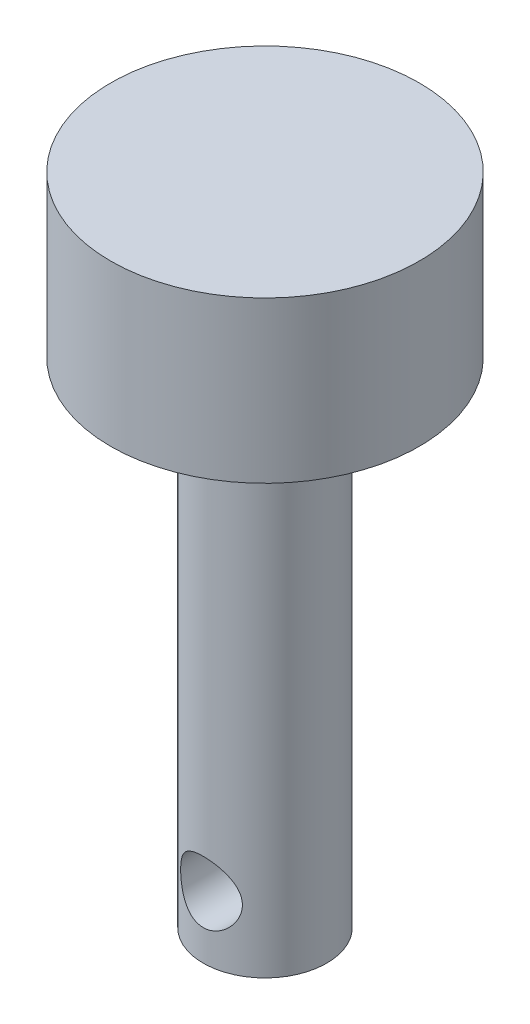
ISO-10303-21;
HEADER;
FILE_DESCRIPTION(('STEP AP214'),'2;1');
FILE_NAME('part.step','',(''),(''),'','','');
FILE_SCHEMA(('AUTOMOTIVE_DESIGN { 1 0 10303 214 1 1 1 1 }'));
ENDSEC;
DATA;
#1=APPLICATION_CONTEXT('core data for automotive mechanical design processes');
#2=APPLICATION_PROTOCOL_DEFINITION('international standard','automotive_design',2000,#1);
#3=PRODUCT_CONTEXT('',#1,'mechanical');
#4=PRODUCT('Part','Part','',(#3));
#5=PRODUCT_RELATED_PRODUCT_CATEGORY('part','',(#4));
#6=PRODUCT_DEFINITION_FORMATION('','',#4);
#7=PRODUCT_DEFINITION_CONTEXT('part definition',#1,'design');
#8=PRODUCT_DEFINITION('design','',#6,#7);
#9=PRODUCT_DEFINITION_SHAPE('','',#8);
#10=(LENGTH_UNIT() NAMED_UNIT(*) SI_UNIT(.MILLI.,.METRE.));
#11=(NAMED_UNIT(*) PLANE_ANGLE_UNIT() SI_UNIT($,.RADIAN.));
#12=(NAMED_UNIT(*) SI_UNIT($,.STERADIAN.) SOLID_ANGLE_UNIT());
#13=UNCERTAINTY_MEASURE_WITH_UNIT(LENGTH_MEASURE(1.E-05),#10,'distance_accuracy_value','');
#14=(GEOMETRIC_REPRESENTATION_CONTEXT(3) GLOBAL_UNCERTAINTY_ASSIGNED_CONTEXT((#13)) GLOBAL_UNIT_ASSIGNED_CONTEXT((#10,
#11,#12)) REPRESENTATION_CONTEXT('',''));
#15=CARTESIAN_POINT('',(0.,0.,0.));
#16=DIRECTION('',(0.,0.,1.));
#17=DIRECTION('',(1.,0.,0.));
#18=AXIS2_PLACEMENT_3D('',#15,#16,#17);
#19=CARTESIAN_POINT('',(0.,0.,0.));
#20=DIRECTION('',(0.,-1.,0.));
#21=DIRECTION('',(0.,0.,-1.));
#22=AXIS2_PLACEMENT_3D('',#19,#20,#21);
#23=CYLINDRICAL_SURFACE('',#22,5.);
#24=CARTESIAN_POINT('',(-2.5,5.,4.33012701892219));
#25=CARTESIAN_POINT('',(-2.49998948436432,5.13026650687649,4.33013982272991));
#26=CARTESIAN_POINT('',(-2.48974954513168,5.26070272067625,4.33609541965583));
#27=CARTESIAN_POINT('',(-2.44930840724944,5.51756897152923,4.35905877051907));
#28=CARTESIAN_POINT('',(-2.41906526369545,5.64399000405729,4.37608974726023));
#29=CARTESIAN_POINT('',(-2.3402497699757,5.88862894556107,4.41873376871659));
#30=CARTESIAN_POINT('',(-2.29177485369963,6.00688657356221,4.44430111338921));
#31=CARTESIAN_POINT('',(-2.17816884056414,6.23356056309455,4.50106659111455));
#32=CARTESIAN_POINT('',(-2.11303684262671,6.34197639179579,4.53226502875883));
#33=CARTESIAN_POINT('',(-1.96166634317253,6.55576430391693,4.59992173524851));
#34=CARTESIAN_POINT('',(-1.87413008816917,6.66014783448977,4.63660159331577));
#35=CARTESIAN_POINT('',(-1.68313452122752,6.8535209757132,4.70929956727453));
#36=CARTESIAN_POINT('',(-1.57966731506051,6.94250290775495,4.74531734512768));
#37=CARTESIAN_POINT('',(-1.35122390789082,7.10841787648564,4.81553692452135));
#38=CARTESIAN_POINT('',(-1.22526797235894,7.18413441927914,4.84945266064072));
#39=CARTESIAN_POINT('',(-0.960392566671147,7.31285213348386,4.90876890230193));
#40=CARTESIAN_POINT('',(-0.821481345389982,7.3658676404385,4.93417477954535));
#41=CARTESIAN_POINT('',(-0.545112359773523,7.44376165316397,4.9720115311507));
#42=CARTESIAN_POINT('',(-0.408254476210982,7.47037381586513,4.98523700553425));
#43=CARTESIAN_POINT('',(-0.131426571755676,7.50041529671129,5.00018959613973));
#44=CARTESIAN_POINT('',(0.00854151460650906,7.50385864199536,5.00192366961168));
#45=CARTESIAN_POINT('',(0.274581311061965,7.48813331506858,4.99407454791405));
#46=CARTESIAN_POINT('',(0.400802997942674,7.47090496119546,4.98546239730476));
#47=CARTESIAN_POINT('',(0.648284429795111,7.41779789023985,4.95935613149294));
#48=CARTESIAN_POINT('',(0.769543802734627,7.38191777755985,4.94186135165964));
#49=CARTESIAN_POINT('',(1.00577347892407,7.29229358477506,4.89928958219156));
#50=CARTESIAN_POINT('',(1.120633558788,7.23830921706972,4.87411103823003));
#51=CARTESIAN_POINT('',(1.33994200378327,7.11434145949638,4.81844114966712));
#52=CARTESIAN_POINT('',(1.4443866220966,7.04435234174416,4.78794790393709));
#53=CARTESIAN_POINT('',(1.6504341522455,6.88276162116743,4.72110985998074));
#54=CARTESIAN_POINT('',(1.75083518757341,6.78974242918497,4.68448439995438));
#55=CARTESIAN_POINT('',(1.93526092574445,6.58852568767457,4.61135851467029));
#56=CARTESIAN_POINT('',(2.01927302893558,6.48031656931485,4.57485820664072));
#57=CARTESIAN_POINT('',(2.17376333660553,6.24337951893978,4.50360390231212));
#58=CARTESIAN_POINT('',(2.24304328744513,6.11378494236447,4.46910799976769));
#59=CARTESIAN_POINT('',(2.35829778250308,5.8426558216025,4.4093862569644));
#60=CARTESIAN_POINT('',(2.40429664552723,5.70113391745609,4.38415075115168));
#61=CARTESIAN_POINT('',(2.4679505275626,5.42196372179303,4.34861589542586));
#62=CARTESIAN_POINT('',(2.48756280529994,5.28489720239113,4.33729139621241));
#63=CARTESIAN_POINT('',(2.50379236652857,5.00899664620864,4.32794798404024));
#64=CARTESIAN_POINT('',(2.50042589328757,4.8701639272005,4.32991967223279));
#65=CARTESIAN_POINT('',(2.47259010835991,4.6108652035532,4.34585841351462));
#66=CARTESIAN_POINT('',(2.45046954178116,4.49005137223027,4.35848968766635));
#67=CARTESIAN_POINT('',(2.38924071158112,4.25408053432252,4.39235053878353));
#68=CARTESIAN_POINT('',(2.35012694655908,4.13892537313315,4.41358290012585));
#69=CARTESIAN_POINT('',(2.25411897151217,3.91147167274361,4.46340555199141));
#70=CARTESIAN_POINT('',(2.19648515923163,3.79955245786744,4.49229108107657));
#71=CARTESIAN_POINT('',(2.0657176600397,3.5863268211512,4.55390298743125));
#72=CARTESIAN_POINT('',(1.99257601083123,3.48502589121186,4.58663133387872));
#73=CARTESIAN_POINT('',(1.82209291799636,3.28255308119668,4.65719996140836));
#74=CARTESIAN_POINT('',(1.72286318078435,3.18300712322778,4.69516457885708));
#75=CARTESIAN_POINT('',(1.5085112384988,3.00146940499409,4.76835587444746));
#76=CARTESIAN_POINT('',(1.39338368664988,2.91948357434145,4.80358162519329));
#77=CARTESIAN_POINT('',(1.14633840638507,2.77356568520911,4.86853404227334));
#78=CARTESIAN_POINT('',(1.01405774389062,2.71016720479154,4.89809104179855));
#79=CARTESIAN_POINT('',(0.738805911647332,2.60715524003798,4.9470838739847));
#80=CARTESIAN_POINT('',(0.595844253647067,2.56752087039488,4.96652859191746));
#81=CARTESIAN_POINT('',(0.317449205674706,2.51657859064358,4.99168770453968));
#82=CARTESIAN_POINT('',(0.182528609085376,2.50300531416965,4.99849819767838));
#83=CARTESIAN_POINT('',(-0.0878149643374311,2.49789183250541,5.00105325940467));
#84=CARTESIAN_POINT('',(-0.223237748727017,2.50634391433891,4.99680170177042));
#85=CARTESIAN_POINT('',(-0.481344982671073,2.54354103039551,4.97834922085637));
#86=CARTESIAN_POINT('',(-0.604280801321772,2.57091217163631,4.96482236636807));
#87=CARTESIAN_POINT('',(-0.843614873664455,2.64331744975833,4.92980234191731));
#88=CARTESIAN_POINT('',(-0.960012187087214,2.68835411963363,4.90830802955518));
#89=CARTESIAN_POINT('',(-1.18855854199593,2.79681781873926,4.85814826741488));
#90=CARTESIAN_POINT('',(-1.30031295715363,2.86094902468984,4.82921542506803));
#91=CARTESIAN_POINT('',(-1.51193650408535,3.00489411014759,4.76720333344986));
#92=CARTESIAN_POINT('',(-1.61180014305397,3.08471519262687,4.73412218229104));
#93=CARTESIAN_POINT('',(-1.8072854232437,3.26699579444936,4.66321523550925));
#94=CARTESIAN_POINT('',(-1.90149582349003,3.37091772600073,4.62524489658366));
#95=CARTESIAN_POINT('',(-2.07165660492504,3.59361528538223,4.55157698284941));
#96=CARTESIAN_POINT('',(-2.1475908315154,3.71240391419923,4.51588143910584));
#97=CARTESIAN_POINT('',(-2.28108393396029,3.96663611766426,4.44998982823926));
#98=CARTESIAN_POINT('',(-2.3379862797745,4.1024873884246,4.42000320346984));
#99=CARTESIAN_POINT('',(-2.40494911880459,4.31322264951977,4.38370272660093));
#100=CARTESIAN_POINT('',(-2.42419582683991,4.38455977569761,4.37305486646054));
#101=CARTESIAN_POINT('',(-2.45635087255789,4.52904069684933,4.35507574170935));
#102=CARTESIAN_POINT('',(-2.46926364179177,4.60218319095442,4.34774215854234));
#103=CARTESIAN_POINT('',(-2.48591166201423,4.72950098654694,4.3382377954292));
#104=CARTESIAN_POINT('',(-2.49118864979203,4.78341632151221,4.33520487024791));
#105=CARTESIAN_POINT('',(-2.49823512543934,4.89154461631041,4.33114674911323));
#106=CARTESIAN_POINT('',(-2.50000437866475,4.94575759581055,4.33012168747261));
#107=CARTESIAN_POINT('',(-2.5,5.,4.33012701892219));
#108=B_SPLINE_CURVE_WITH_KNOTS('',3,(#24,#25,#26,#27,#28,#29,#30,#31,#32,#33,#34,#35,#36,#37,
#38,#39,#40,#41,#42,#43,#44,#45,#46,#47,#48,#49,#50,#51,#52,#53,#54,#55,#56,#57,#58,#59,#60,#61,
#62,#63,#64,#65,#66,#67,#68,#69,#70,#71,#72,#73,#74,#75,#76,#77,#78,#79,#80,#81,#82,#83,#84,#85,
#86,#87,#88,#89,#90,#91,#92,#93,#94,#95,#96,#97,#98,#99,#100,#101,#102,#103,#104,#105,#106,
#107),.UNSPECIFIED.,.T.,.F.,(4,2,2,2,2,2,2,2,2,2,2,2,2,2,2,2,2,2,2,2,2,2,2,2,2,2,2,2,2,2,2,2,2,
2,2,2,2,2,2,2,2,4),(0.,0.390580306486789,0.781982232062013,1.17132148982692,1.56068181366371,
1.98215578129642,2.40383927716011,2.85394730601992,3.30377067414811,3.72158712424921,
4.13915059220183,4.52040243716429,4.90168281298721,5.2882383683295,5.67493248380763,
6.0981797864731,6.5217512061988,6.97222104328704,7.42221935534346,7.83655727140613,
8.25060232976016,8.61935458565148,8.98822631095241,9.37418241020303,9.76033715555202,
10.1951685895662,10.6301466245059,11.076604535375,11.5226694952701,11.927806759788,
12.3328021699001,12.7111106218382,13.0894733378512,13.4840187680376,13.8787457525688,
14.3127560463025,14.7471485711797,15.195268726016,15.4189244153949,15.6424233996907,
15.8050484542806,15.9676843870379),.UNSPECIFIED.);
#109=CARTESIAN_POINT('',(-2.5,5.,4.33012701892219));
#110=VERTEX_POINT('',#109);
#111=EDGE_CURVE('E51',#110,#110,#108,.T.);
#112=ORIENTED_EDGE('',*,*,#111,.T.);
#113=EDGE_LOOP('',(#112));
#114=FACE_BOUND('',#113,.T.);
#115=CARTESIAN_POINT('',(0.,40.,0.));
#116=DIRECTION('',(0.,-1.,0.));
#117=DIRECTION('',(0.,0.,-1.));
#118=AXIS2_PLACEMENT_3D('',#115,#116,#117);
#119=CIRCLE('',#118,5.);
#120=CARTESIAN_POINT('',(0.,40.,-5.));
#121=VERTEX_POINT('',#120);
#122=EDGE_CURVE('E48',#121,#121,#119,.T.);
#123=ORIENTED_EDGE('',*,*,#122,.T.);
#124=EDGE_LOOP('',(#123));
#125=FACE_BOUND('',#124,.T.);
#126=CARTESIAN_POINT('',(0.,0.,0.));
#127=DIRECTION('',(0.,-1.,0.));
#128=DIRECTION('',(0.,0.,-1.));
#129=AXIS2_PLACEMENT_3D('',#126,#127,#128);
#130=CIRCLE('',#129,5.);
#131=CARTESIAN_POINT('',(0.,0.,-5.));
#132=VERTEX_POINT('',#131);
#133=EDGE_CURVE('E85',#132,#132,#130,.T.);
#134=ORIENTED_EDGE('',*,*,#133,.F.);
#135=EDGE_LOOP('',(#134));
#136=FACE_BOUND('',#135,.T.);
#137=CARTESIAN_POINT('',(0.,7.5,-5.));
#138=CARTESIAN_POINT('',(-0.131426682334305,7.49999033094399,-4.99999177550472));
#139=CARTESIAN_POINT('',(-0.263015634437213,7.48957443822597,-4.99476199135277));
#140=CARTESIAN_POINT('',(-0.522301454622883,7.44836817883795,-4.9743541856102));
#141=CARTESIAN_POINT('',(-0.649990448564105,7.41753911907498,-4.9591572718767));
#142=CARTESIAN_POINT('',(-0.897333631316203,7.33701537728116,-4.92040690922477));
#143=CARTESIAN_POINT('',(-1.01701694536277,7.28739401221727,-4.89688595907259));
#144=CARTESIAN_POINT('',(-1.24618160399671,7.17107347374821,-4.84364443325827));
#145=CARTESIAN_POINT('',(-1.3556637520377,7.10437564685491,-4.81392434644421));
#146=CARTESIAN_POINT('',(-1.56876952630998,6.95120686835737,-4.74890645050632));
#147=CARTESIAN_POINT('',(-1.67163802294308,6.86378379977022,-4.71337997659091));
#148=CARTESIAN_POINT('',(-1.86194861703333,6.67369630401471,-4.64149925776731));
#149=CARTESIAN_POINT('',(-1.94937895911555,6.57102037115989,-4.60514440566897));
#150=CARTESIAN_POINT('',(-2.11312999967247,6.34379162555472,-4.53247377945621));
#151=CARTESIAN_POINT('',(-2.18806333849064,6.21815975396499,-4.49637967412567));
#152=CARTESIAN_POINT('',(-2.31542056761491,5.95408166020457,-4.43214946943555));
#153=CARTESIAN_POINT('',(-2.36786053751683,5.81564467823738,-4.40400769020792));
#154=CARTESIAN_POINT('',(-2.44533110537653,5.53833723640359,-4.36144667591402));
#155=CARTESIAN_POINT('',(-2.47181464267578,5.39998886982042,-4.34630678958452));
#156=CARTESIAN_POINT('',(-2.50106748329741,5.12005290556239,-4.3295472487215));
#157=CARTESIAN_POINT('',(-2.50386022093906,4.97846864782491,-4.3279142335843));
#158=CARTESIAN_POINT('',(-2.48671821792512,4.71428493920912,-4.33777325642937));
#159=CARTESIAN_POINT('',(-2.46946139884055,4.59143992194171,-4.34771909154984));
#160=CARTESIAN_POINT('',(-2.41734962264384,4.35069522656805,-4.37690571834675));
#161=CARTESIAN_POINT('',(-2.38248905974454,4.23279713673689,-4.39614947079454));
#162=CARTESIAN_POINT('',(-2.29552445096459,4.00192716858567,-4.44218691031839));
#163=CARTESIAN_POINT('',(-2.24303766778988,3.88913400303548,-4.46914601659993));
#164=CARTESIAN_POINT('',(-2.12260421917012,3.67341426852503,-4.52758510703513));
#165=CARTESIAN_POINT('',(-2.0546506095312,3.57049216099979,-4.55906711950478));
#166=CARTESIAN_POINT('',(-1.89516513728194,3.36369686814192,-4.62782894758213));
#167=CARTESIAN_POINT('',(-1.8017361459232,3.2613578160596,-4.66533775591865));
#168=CARTESIAN_POINT('',(-1.59888894685344,3.07316145352275,-4.73869058251019));
#169=CARTESIAN_POINT('',(-1.48946314143571,2.98731201991529,-4.77453379897003));
#170=CARTESIAN_POINT('',(-1.25129126457962,2.83078584742568,-4.84254968207409));
#171=CARTESIAN_POINT('',(-1.12188397899853,2.76099881888564,-4.87447460405015));
#172=CARTESIAN_POINT('',(-0.851165538721986,2.64475742739248,-4.92894702803109));
#173=CARTESIAN_POINT('',(-0.709863940663163,2.5982845374621,-4.95150197358893));
#174=CARTESIAN_POINT('',(-0.431916229151781,2.53381149070829,-4.98310834353579));
#175=CARTESIAN_POINT('',(-0.295853826370906,2.513771910633,-4.9931234575324));
#176=CARTESIAN_POINT('',(-0.0219489998732884,2.49633817216383,-5.00182533647794));
#177=CARTESIAN_POINT('',(0.115892549675109,2.4989332859015,-5.00051746803426));
#178=CARTESIAN_POINT('',(0.378082429964656,2.5255167210467,-4.98727980633468));
#179=CARTESIAN_POINT('',(0.502648520123707,2.5478313318244,-4.97618114219992));
#180=CARTESIAN_POINT('',(0.746017230755972,2.61059517973838,-4.94555428287529));
#181=CARTESIAN_POINT('',(0.864819214231884,2.65104641613589,-4.92602515837625));
#182=CARTESIAN_POINT('',(1.09722152111965,2.74999616608036,-4.87960628532329));
#183=CARTESIAN_POINT('',(1.21057599249831,2.80897762528232,-4.85252204417873));
#184=CARTESIAN_POINT('',(1.42615340426439,2.94276883912482,-4.7935993579975));
#185=CARTESIAN_POINT('',(1.52837157450203,3.01758533651988,-4.76175888940534));
#186=CARTESIAN_POINT('',(1.72941922315487,3.18940106329089,-4.69270553315087));
#187=CARTESIAN_POINT('',(1.82693019428496,3.2878571709752,-4.65527212009488));
#188=CARTESIAN_POINT('',(2.0046408025722,3.49981287804944,-4.58155978921587));
#189=CARTESIAN_POINT('',(2.08482846428685,3.61332279706986,-4.54528168472407));
#190=CARTESIAN_POINT('',(2.22926978618995,3.85910913548465,-4.4762798054528));
#191=CARTESIAN_POINT('',(2.29256373922243,3.99202816529114,-4.44381323981254));
#192=CARTESIAN_POINT('',(2.39520706511459,4.26877516888255,-4.38935180726746));
#193=CARTESIAN_POINT('',(2.43458729077056,4.41258881599999,-4.36734345549014));
#194=CARTESIAN_POINT('',(2.48465421767005,4.69227555736294,-4.33903752569351));
#195=CARTESIAN_POINT('',(2.4977324874436,4.82758563411897,-4.33143458674096));
#196=CARTESIAN_POINT('',(2.50172288950898,5.09861766738068,-4.32913386592579));
#197=CARTESIAN_POINT('',(2.49264462983266,5.23433941987363,-4.3344304902511));
#198=CARTESIAN_POINT('',(2.45481530197332,5.48870875561685,-4.35594655164663));
#199=CARTESIAN_POINT('',(2.42802074302696,5.60775118172077,-4.37107736338133));
#200=CARTESIAN_POINT('',(2.35793843840544,5.83952029219996,-4.40927540337602));
#201=CARTESIAN_POINT('',(2.31464538728732,5.95224493156654,-4.43234518434965));
#202=CARTESIAN_POINT('',(2.20953919315538,6.17656215271973,-4.48571326433413));
#203=CARTESIAN_POINT('',(2.14667719009403,6.28756985173502,-4.5163930799845));
#204=CARTESIAN_POINT('',(2.0053780838799,6.49818624324005,-4.58088327077455));
#205=CARTESIAN_POINT('',(1.92693287765888,6.59778896262873,-4.61469526970767));
#206=CARTESIAN_POINT('',(1.74550556946066,6.79535536374964,-4.68655816327011));
#207=CARTESIAN_POINT('',(1.6407002246921,6.89164936417138,-4.7246249151498));
#208=CARTESIAN_POINT('',(1.41539785420684,7.06565584942804,-4.79694347383545));
#209=CARTESIAN_POINT('',(1.29489242426332,7.14335831860588,-4.83119321905446));
#210=CARTESIAN_POINT('',(1.03978808878536,7.2780969794841,-4.89245149457782));
#211=CARTESIAN_POINT('',(0.905095560782288,7.33498316778445,-4.91940711437488));
#212=CARTESIAN_POINT('',(0.696328709257351,7.4021838587924,-4.95177960923351));
#213=CARTESIAN_POINT('',(0.625670413494088,7.42155539800181,-4.96122314081874));
#214=CARTESIAN_POINT('',(0.482623997839257,7.4540659483706,-4.97717127275101));
#215=CARTESIAN_POINT('',(0.410236963092401,7.46720876667635,-4.98367766823159));
#216=CARTESIAN_POINT('',(0.28151868462167,7.48473747228463,-4.9923820076613));
#217=CARTESIAN_POINT('',(0.225408499555444,7.49045493653133,-4.99523288466454));
#218=CARTESIAN_POINT('',(0.112875528456288,7.49808832946571,-4.99904367329659));
#219=CARTESIAN_POINT('',(0.0564527338382176,7.50000415322548,-5.00000353273198));
#220=CARTESIAN_POINT('',(0.,7.5,-5.));
#221=B_SPLINE_CURVE_WITH_KNOTS('',3,(#137,#138,#139,#140,#141,#142,#143,#144,#145,#146,#147,
#148,#149,#150,#151,#152,#153,#154,#155,#156,#157,#158,#159,#160,#161,#162,#163,#164,#165,#166,
#167,#168,#169,#170,#171,#172,#173,#174,#175,#176,#177,#178,#179,#180,#181,#182,#183,#184,#185,
#186,#187,#188,#189,#190,#191,#192,#193,#194,#195,#196,#197,#198,#199,#200,#201,#202,#203,#204,
#205,#206,#207,#208,#209,#210,#211,#212,#213,#214,#215,#216,#217,#218,#219,#220),.UNSPECIFIED.,
.T.,.F.,(4,2,2,2,2,2,2,2,2,2,2,2,2,2,2,2,2,2,2,2,2,2,2,2,2,2,2,2,2,2,2,2,2,2,2,2,2,2,2,2,2,4),
(0.,0.394060643550731,0.788870374272994,1.18215538873075,1.57540940145392,1.99245439679522,
2.40981559413509,2.85954316076882,3.30894869745703,3.73145030350574,4.15353393322551,
4.52514281023302,4.89687009814196,5.27725600421219,5.65781303150555,6.08662353334696,
6.51563836496716,6.96457555536102,7.41315542280699,7.82458226178364,8.2358141127869,
8.61517266265305,8.99457304077329,9.38482140069747,9.77523626870849,10.2039902661037,
10.6330397153795,11.0828670540368,11.53211279863,11.9382326875699,12.3441764966107,
12.7114482562151,13.0788382197025,13.4709114195009,13.8631890285845,14.303131068923,
14.7433095845248,15.1866003415819,15.407934939208,15.6291340766843,15.7983933645035,
15.9676573239323),.UNSPECIFIED.);
#222=CARTESIAN_POINT('',(0.,7.5,-5.));
#223=VERTEX_POINT('',#222);
#224=EDGE_CURVE('E35',#223,#223,#221,.T.);
#225=ORIENTED_EDGE('',*,*,#224,.T.);
#226=EDGE_LOOP('',(#225));
#227=FACE_BOUND('',#226,.T.);
#228=ADVANCED_FACE('F31',(#114,#125,#136,#227),#23,.T.);
#229=CARTESIAN_POINT('',(5.,0.,0.));
#230=DIRECTION('',(0.,-1.,0.));
#231=DIRECTION('',(0.,0.,-1.));
#232=AXIS2_PLACEMENT_3D('',#229,#230,#231);
#233=PLANE('',#232);
#234=ORIENTED_EDGE('',*,*,#133,.T.);
#235=EDGE_LOOP('',(#234));
#236=FACE_BOUND('',#235,.T.);
#237=ADVANCED_FACE('F33',(#236),#233,.T.);
#238=CARTESIAN_POINT('',(0.,53.,0.));
#239=DIRECTION('',(0.,1.,0.));
#240=DIRECTION('',(0.,0.,1.));
#241=AXIS2_PLACEMENT_3D('',#238,#239,#240);
#242=PLANE('',#241);
#243=CARTESIAN_POINT('',(0.,53.,0.));
#244=DIRECTION('',(0.,-1.,0.));
#245=DIRECTION('',(0.,0.,-1.));
#246=AXIS2_PLACEMENT_3D('',#243,#244,#245);
#247=CIRCLE('',#246,12.5);
#248=CARTESIAN_POINT('',(0.,53.,-12.5));
#249=VERTEX_POINT('',#248);
#250=EDGE_CURVE('E10',#249,#249,#247,.T.);
#251=ORIENTED_EDGE('',*,*,#250,.F.);
#252=EDGE_LOOP('',(#251));
#253=FACE_BOUND('',#252,.T.);
#254=ADVANCED_FACE('F75',(#253),#242,.T.);
#255=CARTESIAN_POINT('',(0.,0.,0.));
#256=DIRECTION('',(0.,-1.,0.));
#257=DIRECTION('',(0.,0.,-1.));
#258=AXIS2_PLACEMENT_3D('',#255,#256,#257);
#259=CYLINDRICAL_SURFACE('',#258,12.5);
#260=ORIENTED_EDGE('',*,*,#250,.T.);
#261=EDGE_LOOP('',(#260));
#262=FACE_BOUND('',#261,.T.);
#263=CARTESIAN_POINT('',(0.,40.,0.));
#264=DIRECTION('',(0.,-1.,0.));
#265=DIRECTION('',(0.,0.,-1.));
#266=AXIS2_PLACEMENT_3D('',#263,#264,#265);
#267=CIRCLE('',#266,12.5);
#268=CARTESIAN_POINT('',(0.,40.,-12.5));
#269=VERTEX_POINT('',#268);
#270=EDGE_CURVE('E43',#269,#269,#267,.T.);
#271=ORIENTED_EDGE('',*,*,#270,.F.);
#272=EDGE_LOOP('',(#271));
#273=FACE_BOUND('',#272,.T.);
#274=ADVANCED_FACE('F66',(#262,#273),#259,.T.);
#275=CARTESIAN_POINT('',(12.5,40.,0.));
#276=DIRECTION('',(0.,-1.,0.));
#277=DIRECTION('',(0.,0.,-1.));
#278=AXIS2_PLACEMENT_3D('',#275,#276,#277);
#279=PLANE('',#278);
#280=ORIENTED_EDGE('',*,*,#270,.T.);
#281=EDGE_LOOP('',(#280));
#282=FACE_BOUND('',#281,.T.);
#283=ORIENTED_EDGE('',*,*,#122,.F.);
#284=EDGE_LOOP('',(#283));
#285=FACE_BOUND('',#284,.T.);
#286=ADVANCED_FACE('F60',(#282,#285),#279,.T.);
#287=CARTESIAN_POINT('',(0.,5.,10.));
#288=DIRECTION('',(0.,0.,-1.));
#289=DIRECTION('',(-1.,0.,0.));
#290=AXIS2_PLACEMENT_3D('',#287,#288,#289);
#291=CYLINDRICAL_SURFACE('',#290,2.5);
#292=ORIENTED_EDGE('',*,*,#224,.F.);
#293=EDGE_LOOP('',(#292));
#294=FACE_BOUND('',#293,.T.);
#295=ORIENTED_EDGE('',*,*,#111,.F.);
#296=EDGE_LOOP('',(#295));
#297=FACE_BOUND('',#296,.T.);
#298=ADVANCED_FACE('F57',(#294,#297),#291,.F.);
#299=CLOSED_SHELL('',(#228,#237,#254,#274,#286,#298));
#300=MANIFOLD_SOLID_BREP('B2',#299);
#301=ADVANCED_BREP_SHAPE_REPRESENTATION('',(#18,#300),#14);
#302=SHAPE_DEFINITION_REPRESENTATION(#9,#301);
ENDSEC;
END-ISO-10303-21;
